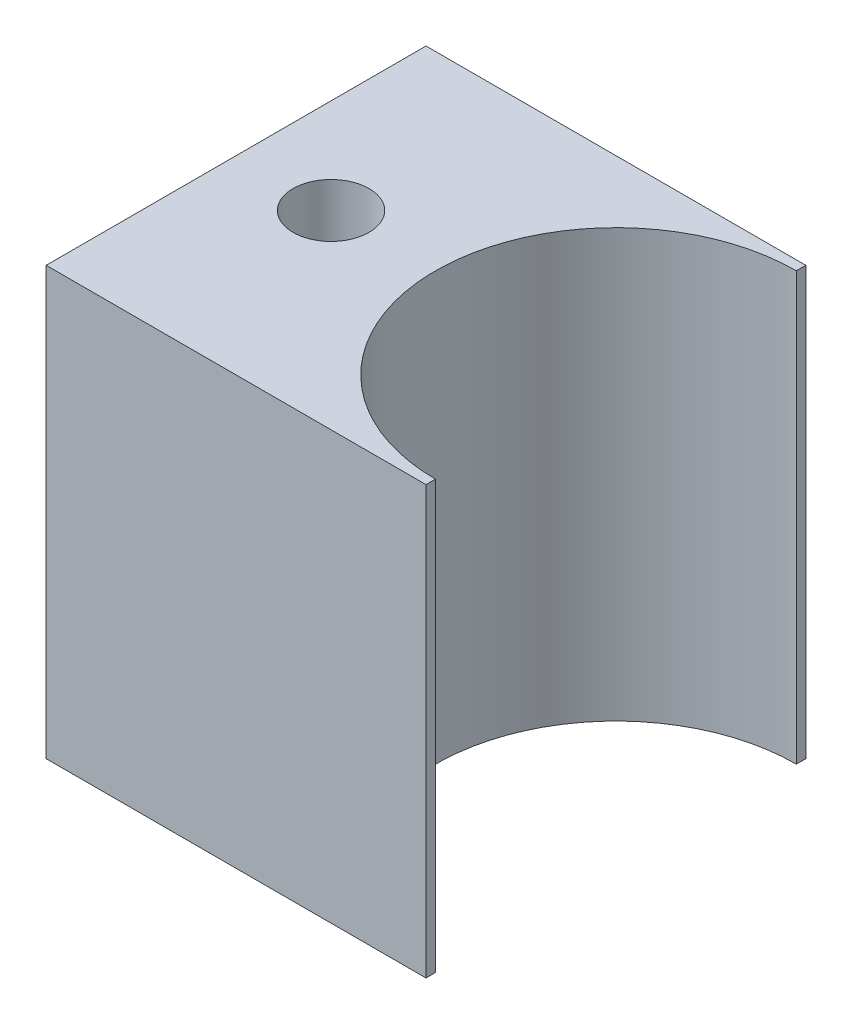
ISO-10303-21;
HEADER;
FILE_DESCRIPTION(('STEP AP214'),'2;1');
FILE_NAME('part.step','',(''),(''),'','','');
FILE_SCHEMA(('AUTOMOTIVE_DESIGN { 1 0 10303 214 1 1 1 1 }'));
ENDSEC;
DATA;
#1=APPLICATION_CONTEXT('core data for automotive mechanical design processes');
#2=APPLICATION_PROTOCOL_DEFINITION('international standard','automotive_design',2000,#1);
#3=PRODUCT_CONTEXT('',#1,'mechanical');
#4=PRODUCT('Part','Part','',(#3));
#5=PRODUCT_RELATED_PRODUCT_CATEGORY('part','',(#4));
#6=PRODUCT_DEFINITION_FORMATION('','',#4);
#7=PRODUCT_DEFINITION_CONTEXT('part definition',#1,'design');
#8=PRODUCT_DEFINITION('design','',#6,#7);
#9=PRODUCT_DEFINITION_SHAPE('','',#8);
#10=(LENGTH_UNIT() NAMED_UNIT(*) SI_UNIT(.MILLI.,.METRE.));
#11=(NAMED_UNIT(*) PLANE_ANGLE_UNIT() SI_UNIT($,.RADIAN.));
#12=(NAMED_UNIT(*) SI_UNIT($,.STERADIAN.) SOLID_ANGLE_UNIT());
#13=UNCERTAINTY_MEASURE_WITH_UNIT(LENGTH_MEASURE(1.E-05),#10,'distance_accuracy_value','');
#14=(GEOMETRIC_REPRESENTATION_CONTEXT(3) GLOBAL_UNCERTAINTY_ASSIGNED_CONTEXT((#13)) GLOBAL_UNIT_ASSIGNED_CONTEXT((#10,
#11,#12)) REPRESENTATION_CONTEXT('',''));
#15=CARTESIAN_POINT('',(0.,0.,0.));
#16=DIRECTION('',(0.,0.,1.));
#17=DIRECTION('',(1.,0.,0.));
#18=AXIS2_PLACEMENT_3D('',#15,#16,#17);
#19=CARTESIAN_POINT('',(-25.4,28.575,0.));
#20=DIRECTION('',(-1.,0.,0.));
#21=DIRECTION('',(0.,0.,1.));
#22=AXIS2_PLACEMENT_3D('',#19,#20,#21);
#23=PLANE('',#22);
#24=DIRECTION('',(0.,0.,-1.));
#25=VECTOR('',#24,1.);
#26=CARTESIAN_POINT('',(-25.4,0.,0.));
#27=LINE('',#26,#25);
#28=CARTESIAN_POINT('',(-25.4,0.,0.));
#29=VERTEX_POINT('',#28);
#30=CARTESIAN_POINT('',(-25.4,0.,-25.4));
#31=VERTEX_POINT('',#30);
#32=EDGE_CURVE('E118',#29,#31,#27,.T.);
#33=ORIENTED_EDGE('',*,*,#32,.F.);
#34=DIRECTION('',(0.,-1.,0.));
#35=VECTOR('',#34,1.);
#36=CARTESIAN_POINT('',(-25.4,28.575,0.));
#37=LINE('',#36,#35);
#38=CARTESIAN_POINT('',(-25.4,28.575,0.));
#39=VERTEX_POINT('',#38);
#40=EDGE_CURVE('E11',#39,#29,#37,.T.);
#41=ORIENTED_EDGE('',*,*,#40,.F.);
#42=DIRECTION('',(0.,0.,-1.));
#43=VECTOR('',#42,1.);
#44=CARTESIAN_POINT('',(-25.4,28.575,0.));
#45=LINE('',#44,#43);
#46=CARTESIAN_POINT('',(-25.4,28.575,-25.4));
#47=VERTEX_POINT('',#46);
#48=EDGE_CURVE('E133',#39,#47,#45,.T.);
#49=ORIENTED_EDGE('',*,*,#48,.T.);
#50=DIRECTION('',(0.,-1.,0.));
#51=VECTOR('',#50,1.);
#52=CARTESIAN_POINT('',(-25.4,28.575,-25.4));
#53=LINE('',#52,#51);
#54=EDGE_CURVE('E36',#47,#31,#53,.T.);
#55=ORIENTED_EDGE('',*,*,#54,.T.);
#56=EDGE_LOOP('',(#33,#41,#49,#55));
#57=FACE_BOUND('',#56,.T.);
#58=ADVANCED_FACE('F33',(#57),#23,.T.);
#59=CARTESIAN_POINT('',(0.,28.575,0.));
#60=DIRECTION('',(0.,0.,1.));
#61=DIRECTION('',(1.,0.,0.));
#62=AXIS2_PLACEMENT_3D('',#59,#60,#61);
#63=PLANE('',#62);
#64=DIRECTION('',(-1.,0.,0.));
#65=VECTOR('',#64,1.);
#66=CARTESIAN_POINT('',(0.,0.,0.));
#67=LINE('',#66,#65);
#68=CARTESIAN_POINT('',(0.,0.,0.));
#69=VERTEX_POINT('',#68);
#70=EDGE_CURVE('E131',#69,#29,#67,.T.);
#71=ORIENTED_EDGE('',*,*,#70,.F.);
#72=DIRECTION('',(0.,-1.,0.));
#73=VECTOR('',#72,1.);
#74=CARTESIAN_POINT('',(0.,28.575,0.));
#75=LINE('',#74,#73);
#76=CARTESIAN_POINT('',(0.,28.575,0.));
#77=VERTEX_POINT('',#76);
#78=EDGE_CURVE('E42',#77,#69,#75,.T.);
#79=ORIENTED_EDGE('',*,*,#78,.F.);
#80=DIRECTION('',(-1.,0.,0.));
#81=VECTOR('',#80,1.);
#82=CARTESIAN_POINT('',(0.,28.575,0.));
#83=LINE('',#82,#81);
#84=EDGE_CURVE('E98',#77,#39,#83,.T.);
#85=ORIENTED_EDGE('',*,*,#84,.T.);
#86=ORIENTED_EDGE('',*,*,#40,.T.);
#87=EDGE_LOOP('',(#71,#79,#85,#86));
#88=FACE_BOUND('',#87,.T.);
#89=ADVANCED_FACE('F141',(#88),#63,.T.);
#90=CARTESIAN_POINT('',(0.,28.575,0.));
#91=DIRECTION('',(-1.,0.,0.));
#92=DIRECTION('',(0.,0.,1.));
#93=AXIS2_PLACEMENT_3D('',#90,#91,#92);
#94=PLANE('',#93);
#95=DIRECTION('',(0.,0.,-1.));
#96=VECTOR('',#95,1.);
#97=CARTESIAN_POINT('',(0.,0.,0.));
#98=LINE('',#97,#96);
#99=CARTESIAN_POINT('',(0.,0.,-0.635));
#100=VERTEX_POINT('',#99);
#101=EDGE_CURVE('E103',#69,#100,#98,.T.);
#102=ORIENTED_EDGE('',*,*,#101,.T.);
#103=DIRECTION('',(0.,-1.,0.));
#104=VECTOR('',#103,1.);
#105=CARTESIAN_POINT('',(0.,28.575,-0.635));
#106=LINE('',#105,#104);
#107=CARTESIAN_POINT('',(0.,28.575,-0.635));
#108=VERTEX_POINT('',#107);
#109=EDGE_CURVE('E101',#108,#100,#106,.T.);
#110=ORIENTED_EDGE('',*,*,#109,.F.);
#111=DIRECTION('',(0.,0.,-1.));
#112=VECTOR('',#111,1.);
#113=CARTESIAN_POINT('',(0.,28.575,0.));
#114=LINE('',#113,#112);
#115=EDGE_CURVE('E91',#77,#108,#114,.T.);
#116=ORIENTED_EDGE('',*,*,#115,.F.);
#117=ORIENTED_EDGE('',*,*,#78,.T.);
#118=EDGE_LOOP('',(#102,#110,#116,#117));
#119=FACE_BOUND('',#118,.T.);
#120=ADVANCED_FACE('F102',(#119),#94,.F.);
#121=CARTESIAN_POINT('',(0.,28.575,-12.7));
#122=DIRECTION('',(0.,-1.,0.));
#123=DIRECTION('',(0.,0.,-1.));
#124=AXIS2_PLACEMENT_3D('',#121,#122,#123);
#125=CYLINDRICAL_SURFACE('',#124,12.065);
#126=CARTESIAN_POINT('',(0.,0.,-12.7));
#127=DIRECTION('',(0.,-1.,0.));
#128=DIRECTION('',(0.,0.,-1.));
#129=AXIS2_PLACEMENT_3D('',#126,#127,#128);
#130=CIRCLE('',#129,12.065);
#131=CARTESIAN_POINT('',(0.,0.,-24.765));
#132=VERTEX_POINT('',#131);
#133=EDGE_CURVE('E128',#100,#132,#130,.T.);
#134=ORIENTED_EDGE('',*,*,#133,.T.);
#135=DIRECTION('',(0.,-1.,0.));
#136=VECTOR('',#135,1.);
#137=CARTESIAN_POINT('',(0.,28.575,-24.765));
#138=LINE('',#137,#136);
#139=CARTESIAN_POINT('',(0.,28.575,-24.765));
#140=VERTEX_POINT('',#139);
#141=EDGE_CURVE('E107',#140,#132,#138,.T.);
#142=ORIENTED_EDGE('',*,*,#141,.F.);
#143=CARTESIAN_POINT('',(0.,28.575,-12.7));
#144=DIRECTION('',(0.,-1.,0.));
#145=DIRECTION('',(0.,0.,-1.));
#146=AXIS2_PLACEMENT_3D('',#143,#144,#145);
#147=CIRCLE('',#146,12.065);
#148=EDGE_CURVE('E96',#108,#140,#147,.T.);
#149=ORIENTED_EDGE('',*,*,#148,.F.);
#150=ORIENTED_EDGE('',*,*,#109,.T.);
#151=EDGE_LOOP('',(#134,#142,#149,#150));
#152=FACE_BOUND('',#151,.T.);
#153=ADVANCED_FACE('F109',(#152),#125,.F.);
#154=CARTESIAN_POINT('',(0.,28.575,-25.4));
#155=DIRECTION('',(1.,0.,0.));
#156=DIRECTION('',(0.,0.,-1.));
#157=AXIS2_PLACEMENT_3D('',#154,#155,#156);
#158=PLANE('',#157);
#159=DIRECTION('',(0.,0.,1.));
#160=VECTOR('',#159,1.);
#161=CARTESIAN_POINT('',(0.,0.,-25.4));
#162=LINE('',#161,#160);
#163=CARTESIAN_POINT('',(0.,0.,-25.4));
#164=VERTEX_POINT('',#163);
#165=EDGE_CURVE('E125',#164,#132,#162,.T.);
#166=ORIENTED_EDGE('',*,*,#165,.F.);
#167=DIRECTION('',(0.,-1.,0.));
#168=VECTOR('',#167,1.);
#169=CARTESIAN_POINT('',(0.,28.575,-25.4));
#170=LINE('',#169,#168);
#171=CARTESIAN_POINT('',(0.,28.575,-25.4));
#172=VERTEX_POINT('',#171);
#173=EDGE_CURVE('E136',#172,#164,#170,.T.);
#174=ORIENTED_EDGE('',*,*,#173,.F.);
#175=DIRECTION('',(0.,0.,1.));
#176=VECTOR('',#175,1.);
#177=CARTESIAN_POINT('',(0.,28.575,-25.4));
#178=LINE('',#177,#176);
#179=EDGE_CURVE('E111',#172,#140,#178,.T.);
#180=ORIENTED_EDGE('',*,*,#179,.T.);
#181=ORIENTED_EDGE('',*,*,#141,.T.);
#182=EDGE_LOOP('',(#166,#174,#180,#181));
#183=FACE_BOUND('',#182,.T.);
#184=ADVANCED_FACE('F154',(#183),#158,.T.);
#185=CARTESIAN_POINT('',(-25.4,28.575,-25.4));
#186=DIRECTION('',(0.,0.,-1.));
#187=DIRECTION('',(-1.,0.,0.));
#188=AXIS2_PLACEMENT_3D('',#185,#186,#187);
#189=PLANE('',#188);
#190=DIRECTION('',(1.,0.,0.));
#191=VECTOR('',#190,1.);
#192=CARTESIAN_POINT('',(-25.4,0.,-25.4));
#193=LINE('',#192,#191);
#194=EDGE_CURVE('E121',#31,#164,#193,.T.);
#195=ORIENTED_EDGE('',*,*,#194,.F.);
#196=ORIENTED_EDGE('',*,*,#54,.F.);
#197=DIRECTION('',(1.,0.,0.));
#198=VECTOR('',#197,1.);
#199=CARTESIAN_POINT('',(-25.4,28.575,-25.4));
#200=LINE('',#199,#198);
#201=EDGE_CURVE('E113',#47,#172,#200,.T.);
#202=ORIENTED_EDGE('',*,*,#201,.T.);
#203=ORIENTED_EDGE('',*,*,#173,.T.);
#204=EDGE_LOOP('',(#195,#196,#202,#203));
#205=FACE_BOUND('',#204,.T.);
#206=ADVANCED_FACE('F138',(#205),#189,.T.);
#207=CARTESIAN_POINT('',(0.,28.575,-12.7));
#208=DIRECTION('',(0.,-1.,0.));
#209=DIRECTION('',(0.,0.,-1.));
#210=AXIS2_PLACEMENT_3D('',#207,#208,#209);
#211=PLANE('',#210);
#212=CARTESIAN_POINT('',(-19.05,28.575,-12.7));
#213=DIRECTION('',(0.,-1.,0.));
#214=DIRECTION('',(0.,0.,-1.));
#215=AXIS2_PLACEMENT_3D('',#212,#213,#214);
#216=CIRCLE('',#215,2.54);
#217=CARTESIAN_POINT('',(-19.05,28.575,-15.24));
#218=VERTEX_POINT('',#217);
#219=EDGE_CURVE('E122',#218,#218,#216,.T.);
#220=ORIENTED_EDGE('',*,*,#219,.T.);
#221=EDGE_LOOP('',(#220));
#222=FACE_BOUND('',#221,.T.);
#223=ORIENTED_EDGE('',*,*,#48,.F.);
#224=ORIENTED_EDGE('',*,*,#84,.F.);
#225=ORIENTED_EDGE('',*,*,#115,.T.);
#226=ORIENTED_EDGE('',*,*,#148,.T.);
#227=ORIENTED_EDGE('',*,*,#179,.F.);
#228=ORIENTED_EDGE('',*,*,#201,.F.);
#229=EDGE_LOOP('',(#223,#224,#225,#226,#227,#228));
#230=FACE_BOUND('',#229,.T.);
#231=ADVANCED_FACE('F93',(#222,#230),#211,.F.);
#232=CARTESIAN_POINT('',(0.,0.,-12.7));
#233=DIRECTION('',(0.,-1.,0.));
#234=DIRECTION('',(0.,0.,-1.));
#235=AXIS2_PLACEMENT_3D('',#232,#233,#234);
#236=PLANE('',#235);
#237=CARTESIAN_POINT('',(-19.05,0.,-12.7));
#238=DIRECTION('',(0.,-1.,0.));
#239=DIRECTION('',(0.,0.,-1.));
#240=AXIS2_PLACEMENT_3D('',#237,#238,#239);
#241=CIRCLE('',#240,2.54);
#242=CARTESIAN_POINT('',(-19.05,0.,-15.24));
#243=VERTEX_POINT('',#242);
#244=EDGE_CURVE('E177',#243,#243,#241,.T.);
#245=ORIENTED_EDGE('',*,*,#244,.F.);
#246=EDGE_LOOP('',(#245));
#247=FACE_BOUND('',#246,.T.);
#248=ORIENTED_EDGE('',*,*,#32,.T.);
#249=ORIENTED_EDGE('',*,*,#194,.T.);
#250=ORIENTED_EDGE('',*,*,#165,.T.);
#251=ORIENTED_EDGE('',*,*,#133,.F.);
#252=ORIENTED_EDGE('',*,*,#101,.F.);
#253=ORIENTED_EDGE('',*,*,#70,.T.);
#254=EDGE_LOOP('',(#248,#249,#250,#251,#252,#253));
#255=FACE_BOUND('',#254,.T.);
#256=ADVANCED_FACE('F140',(#247,#255),#236,.T.);
#257=CARTESIAN_POINT('',(-19.05,28.575,-12.7));
#258=DIRECTION('',(0.,-1.,0.));
#259=DIRECTION('',(0.,0.,-1.));
#260=AXIS2_PLACEMENT_3D('',#257,#258,#259);
#261=CYLINDRICAL_SURFACE('',#260,2.54);
#262=ORIENTED_EDGE('',*,*,#219,.F.);
#263=EDGE_LOOP('',(#262));
#264=FACE_BOUND('',#263,.T.);
#265=ORIENTED_EDGE('',*,*,#244,.T.);
#266=EDGE_LOOP('',(#265));
#267=FACE_BOUND('',#266,.T.);
#268=ADVANCED_FACE('F165',(#264,#267),#261,.F.);
#269=CLOSED_SHELL('',(#58,#89,#120,#153,#184,#206,#231,#256,#268));
#270=MANIFOLD_SOLID_BREP('B2',#269);
#271=ADVANCED_BREP_SHAPE_REPRESENTATION('',(#18,#270),#14);
#272=SHAPE_DEFINITION_REPRESENTATION(#9,#271);
ENDSEC;
END-ISO-10303-21;
